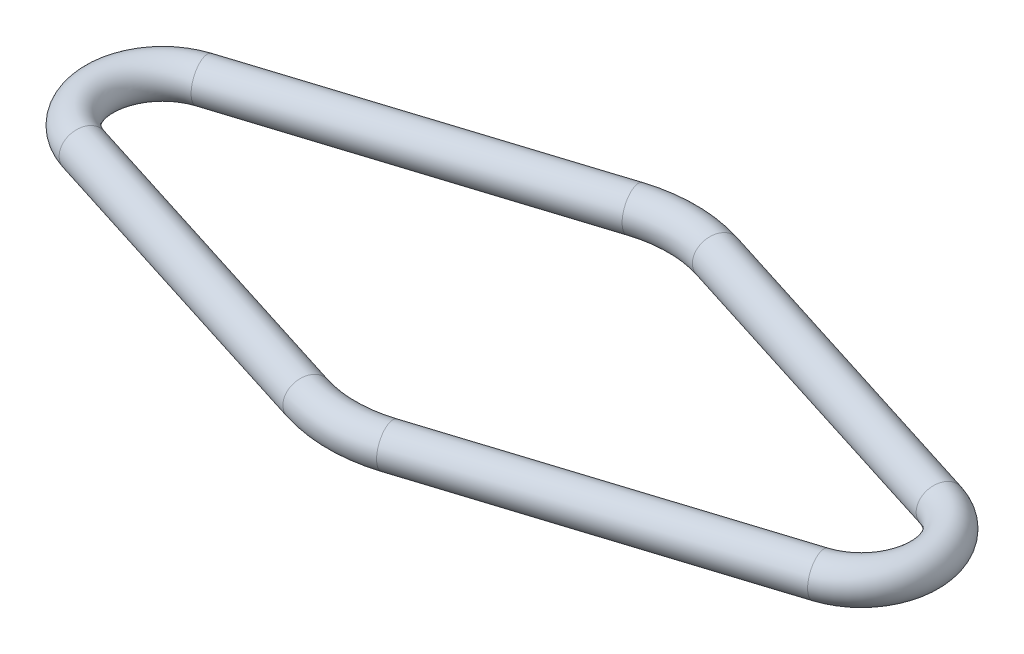
ISO-10303-21;
HEADER;
FILE_DESCRIPTION(('STEP AP214'),'2;1');
FILE_NAME('part.step','',(''),(''),'','','');
FILE_SCHEMA(('AUTOMOTIVE_DESIGN { 1 0 10303 214 1 1 1 1 }'));
ENDSEC;
DATA;
#1=APPLICATION_CONTEXT('core data for automotive mechanical design processes');
#2=APPLICATION_PROTOCOL_DEFINITION('international standard','automotive_design',2000,#1);
#3=PRODUCT_CONTEXT('',#1,'mechanical');
#4=PRODUCT('Part','Part','',(#3));
#5=PRODUCT_RELATED_PRODUCT_CATEGORY('part','',(#4));
#6=PRODUCT_DEFINITION_FORMATION('','',#4);
#7=PRODUCT_DEFINITION_CONTEXT('part definition',#1,'design');
#8=PRODUCT_DEFINITION('design','',#6,#7);
#9=PRODUCT_DEFINITION_SHAPE('','',#8);
#10=(LENGTH_UNIT() NAMED_UNIT(*) SI_UNIT(.MILLI.,.METRE.));
#11=(NAMED_UNIT(*) PLANE_ANGLE_UNIT() SI_UNIT($,.RADIAN.));
#12=(NAMED_UNIT(*) SI_UNIT($,.STERADIAN.) SOLID_ANGLE_UNIT());
#13=UNCERTAINTY_MEASURE_WITH_UNIT(LENGTH_MEASURE(1.E-05),#10,'distance_accuracy_value','');
#14=(GEOMETRIC_REPRESENTATION_CONTEXT(3) GLOBAL_UNCERTAINTY_ASSIGNED_CONTEXT((#13)) GLOBAL_UNIT_ASSIGNED_CONTEXT((#10,
#11,#12)) REPRESENTATION_CONTEXT('',''));
#15=CARTESIAN_POINT('',(0.,0.,0.));
#16=DIRECTION('',(0.,0.,1.));
#17=DIRECTION('',(1.,0.,0.));
#18=AXIS2_PLACEMENT_3D('',#15,#16,#17);
#19=CARTESIAN_POINT('',(-1.68984396552235,0.,6.75004542451107));
#20=DIRECTION('',(-0.953384602019686,0.,-0.301757850986124));
#21=DIRECTION('',(-0.301757850986124,0.,0.953384602019687));
#22=AXIS2_PLACEMENT_3D('',#19,#20,#21);
#23=CYLINDRICAL_SURFACE('',#22,0.8);
#24=CARTESIAN_POINT('',(-15.1845704125639,0.,2.47879996525119));
#25=DIRECTION('',(0.953384602019687,0.,0.301757850986124));
#26=DIRECTION('',(0.301757850986124,0.,-0.953384602019687));
#27=AXIS2_PLACEMENT_3D('',#24,#25,#26);
#28=CIRCLE('',#27,0.8);
#29=CARTESIAN_POINT('',(-15.4259766933528,0.,3.24150764686694));
#30=VERTEX_POINT('',#29);
#31=EDGE_CURVE('E56',#30,#30,#28,.T.);
#32=ORIENTED_EDGE('',*,*,#31,.T.);
#33=EDGE_LOOP('',(#32));
#34=FACE_BOUND('',#33,.T.);
#35=CARTESIAN_POINT('',(-1.68984396552235,0.,6.75004542451107));
#36=DIRECTION('',(0.953384602019687,0.,0.301757850986124));
#37=DIRECTION('',(0.301757850986124,0.,-0.953384602019687));
#38=AXIS2_PLACEMENT_3D('',#35,#36,#37);
#39=CIRCLE('',#38,0.8);
#40=CARTESIAN_POINT('',(-1.93125024631125,0.,7.51275310612682));
#41=VERTEX_POINT('',#40);
#42=EDGE_CURVE('E59',#41,#41,#39,.T.);
#43=ORIENTED_EDGE('',*,*,#42,.F.);
#44=EDGE_LOOP('',(#43));
#45=FACE_BOUND('',#44,.T.);
#46=ADVANCED_FACE('F30',(#34,#45),#23,.T.);
#47=CARTESIAN_POINT('',(-14.4,0.,0.));
#48=DIRECTION('',(0.,-1.,0.));
#49=DIRECTION('',(0.,0.,-1.));
#50=AXIS2_PLACEMENT_3D('',#47,#48,#49);
#51=TOROIDAL_SURFACE('',#50,2.6,0.8);
#52=CARTESIAN_POINT('',(-15.1845704125639,0.,-2.47879996525119));
#53=DIRECTION('',(-0.953384602019687,0.,0.301757850986124));
#54=DIRECTION('',(0.301757850986124,0.,0.953384602019687));
#55=AXIS2_PLACEMENT_3D('',#52,#53,#54);
#56=CIRCLE('',#55,0.8);
#57=CARTESIAN_POINT('',(-15.4259766933528,0.,-3.24150764686694));
#58=VERTEX_POINT('',#57);
#59=EDGE_CURVE('E53',#58,#58,#56,.T.);
#60=CARTESIAN_POINT('',(-14.4,0.,0.));
#61=DIRECTION('',(0.,-1.,0.));
#62=DIRECTION('',(0.,0.,-1.));
#63=AXIS2_PLACEMENT_3D('',#60,#61,#62);
#64=CIRCLE('',#63,3.4);
#65=EDGE_CURVE('',#30,#58,#64,.T.);
#66=ORIENTED_EDGE('',*,*,#31,.F.);
#67=ORIENTED_EDGE('',*,*,#59,.T.);
#68=ORIENTED_EDGE('',*,*,#65,.T.);
#69=ORIENTED_EDGE('',*,*,#65,.F.);
#70=EDGE_LOOP('',(#66,#68,#67,#69));
#71=FACE_BOUND('',#70,.T.);
#72=ADVANCED_FACE('F66',(#71),#51,.T.);
#73=CARTESIAN_POINT('',(-15.1845704125639,0.,-2.47879996525119));
#74=DIRECTION('',(0.953384602019686,0.,-0.301757850986124));
#75=DIRECTION('',(-0.301757850986124,0.,-0.953384602019687));
#76=AXIS2_PLACEMENT_3D('',#73,#74,#75);
#77=CYLINDRICAL_SURFACE('',#76,0.8);
#78=CARTESIAN_POINT('',(-1.68984396552235,0.,-6.75004542451107));
#79=DIRECTION('',(-0.953384602019687,0.,0.301757850986124));
#80=DIRECTION('',(0.301757850986124,0.,0.953384602019686));
#81=AXIS2_PLACEMENT_3D('',#78,#79,#80);
#82=CIRCLE('',#81,0.8);
#83=CARTESIAN_POINT('',(-1.93125024631125,0.,-7.51275310612682));
#84=VERTEX_POINT('',#83);
#85=EDGE_CURVE('E50',#84,#84,#82,.T.);
#86=CARTESIAN_POINT('',(-1.93125024631125,0.,-7.51275310612682));
#87=CARTESIAN_POINT('',(-2.07182031346793,0.,-7.4682609659262));
#88=CARTESIAN_POINT('',(-2.21239038062462,0.,-7.42376882572557));
#89=CARTESIAN_POINT('',(-2.49353051493798,0.,-7.33478454532433));
#90=CARTESIAN_POINT('',(-2.63410058209467,0.,-7.2902924051237));
#91=CARTESIAN_POINT('',(-2.91524071640803,0.,-7.20130812472245));
#92=CARTESIAN_POINT('',(-3.05581078356472,0.,-7.15681598452183));
#93=CARTESIAN_POINT('',(-3.33695091787808,0.,-7.06783170412058));
#94=CARTESIAN_POINT('',(-3.47752098503476,0.,-7.02333956391996));
#95=CARTESIAN_POINT('',(-3.75866111934813,0.,-6.93435528351871));
#96=CARTESIAN_POINT('',(-3.89923118650481,0.,-6.88986314331809));
#97=CARTESIAN_POINT('',(-4.18037132081818,0.,-6.80087886291684));
#98=CARTESIAN_POINT('',(-4.32094138797486,0.,-6.75638672271622));
#99=CARTESIAN_POINT('',(-4.60208152228823,0.,-6.66740244231497));
#100=CARTESIAN_POINT('',(-4.74265158944491,0.,-6.62291030211435));
#101=CARTESIAN_POINT('',(-5.02379172375828,0.,-6.5339260217131));
#102=CARTESIAN_POINT('',(-5.16436179091496,0.,-6.48943388151247));
#103=CARTESIAN_POINT('',(-5.44550192522833,0.,-6.40044960111123));
#104=CARTESIAN_POINT('',(-5.58607199238501,0.,-6.3559574609106));
#105=CARTESIAN_POINT('',(-5.86721212669838,0.,-6.26697318050935));
#106=CARTESIAN_POINT('',(-6.00778219385506,0.,-6.22248104030873));
#107=CARTESIAN_POINT('',(-6.28892232816843,0.,-6.13349675990748));
#108=CARTESIAN_POINT('',(-6.42949239532511,0.,-6.08900461970686));
#109=CARTESIAN_POINT('',(-6.71063252963848,0.,-6.00002033930561));
#110=CARTESIAN_POINT('',(-6.85120259679516,0.,-5.95552819910499));
#111=CARTESIAN_POINT('',(-7.13234273110853,0.,-5.86654391870374));
#112=CARTESIAN_POINT('',(-7.27291279826521,0.,-5.82205177850312));
#113=CARTESIAN_POINT('',(-7.55405293257857,0.,-5.73306749810187));
#114=CARTESIAN_POINT('',(-7.69462299973526,0.,-5.68857535790124));
#115=CARTESIAN_POINT('',(-7.97576313404862,0.,-5.5995910775));
#116=CARTESIAN_POINT('',(-8.1163332012053,0.,-5.55509893729937));
#117=CARTESIAN_POINT('',(-8.39747333551867,0.,-5.46611465689813));
#118=CARTESIAN_POINT('',(-8.53804340267535,0.,-5.4216225166975));
#119=CARTESIAN_POINT('',(-8.81918353698872,0.,-5.33263823629625));
#120=CARTESIAN_POINT('',(-8.9597536041454,0.,-5.28814609609563));
#121=CARTESIAN_POINT('',(-9.24089373845877,0.,-5.19916181569438));
#122=CARTESIAN_POINT('',(-9.38146380561545,0.,-5.15466967549376));
#123=CARTESIAN_POINT('',(-9.66260393992882,0.,-5.06568539509251));
#124=CARTESIAN_POINT('',(-9.8031740070855,0.,-5.02119325489189));
#125=CARTESIAN_POINT('',(-10.0843141413989,0.,-4.93220897449064));
#126=CARTESIAN_POINT('',(-10.2248842085556,0.,-4.88771683429002));
#127=CARTESIAN_POINT('',(-10.5060243428689,0.,-4.79873255388877));
#128=CARTESIAN_POINT('',(-10.6465944100256,0.,-4.75424041368814));
#129=CARTESIAN_POINT('',(-10.927734544339,0.,-4.6652561332869));
#130=CARTESIAN_POINT('',(-11.0683046114957,0.,-4.62076399308627));
#131=CARTESIAN_POINT('',(-11.349444745809,0.,-4.53177971268502));
#132=CARTESIAN_POINT('',(-11.4900148129657,0.,-4.4872875724844));
#133=CARTESIAN_POINT('',(-11.7711549472791,0.,-4.39830329208315));
#134=CARTESIAN_POINT('',(-11.9117250144357,0.,-4.35381115188253));
#135=CARTESIAN_POINT('',(-12.1928651487491,0.,-4.26482687148128));
#136=CARTESIAN_POINT('',(-12.3334352159058,0.,-4.22033473128066));
#137=CARTESIAN_POINT('',(-12.6145753502192,0.,-4.13135045087941));
#138=CARTESIAN_POINT('',(-12.7551454173758,0.,-4.08685831067879));
#139=CARTESIAN_POINT('',(-13.0362855516892,0.,-3.99787403027754));
#140=CARTESIAN_POINT('',(-13.1768556188459,0.,-3.95338189007692));
#141=CARTESIAN_POINT('',(-13.4579957531593,0.,-3.86439760967567));
#142=CARTESIAN_POINT('',(-13.5985658203159,0.,-3.81990546947504));
#143=CARTESIAN_POINT('',(-13.8797059546293,0.,-3.7309211890738));
#144=CARTESIAN_POINT('',(-14.020276021786,0.,-3.68642904887317));
#145=CARTESIAN_POINT('',(-14.3014161560994,0.,-3.59744476847193));
#146=CARTESIAN_POINT('',(-14.441986223256,0.,-3.5529526282713));
#147=CARTESIAN_POINT('',(-14.7231263575694,0.,-3.46396834787005));
#148=CARTESIAN_POINT('',(-14.8636964247261,0.,-3.41947620766943));
#149=CARTESIAN_POINT('',(-15.1448365590395,0.,-3.33049192726818));
#150=CARTESIAN_POINT('',(-15.2854066261961,0.,-3.28599978706756));
#151=CARTESIAN_POINT('',(-15.4259766933528,0.,-3.24150764686694));
#152=B_SPLINE_CURVE_WITH_KNOTS('',3,(#86,#87,#88,#89,#90,#91,#92,#93,#94,#95,#96,#97,#98,#99,
#100,#101,#102,#103,#104,#105,#106,#107,#108,#109,#110,#111,#112,#113,#114,#115,#116,#117,#118,
#119,#120,#121,#122,#123,#124,#125,#126,#127,#128,#129,#130,#131,#132,#133,#134,#135,#136,#137,
#138,#139,#140,#141,#142,#143,#144,#145,#146,#147,#148,#149,#150,#151),.UNSPECIFIED.,.F.,.F.,(4,
2,2,2,2,2,2,2,2,2,2,2,2,2,2,2,2,2,2,2,2,2,2,2,2,2,2,2,2,2,2,2,4),(0.,0.442329570434306,
0.884659140868611,1.32698871130292,1.76931828173722,2.21164785217153,2.65397742260583,
3.09630699304014,3.53863656347444,3.98096613390875,4.42329570434306,4.86562527477736,
5.30795484521167,5.75028441564597,6.19261398608027,6.63494355651458,7.07727312694889,
7.51960269738319,7.9619322678175,8.4042618382518,8.84659140868611,9.28892097912042,
9.73125054955472,10.173580119989,10.6159096904233,11.0582392608576,11.5005688312919,
11.9428984017262,12.3852279721606,12.8275575425949,13.2698871130292,13.7122166834635,
14.1545462538978),.UNSPECIFIED.);
#153=EDGE_CURVE('BSEAM72',#84,#58,#152,.T.);
#154=ORIENTED_EDGE('',*,*,#85,.T.);
#155=ORIENTED_EDGE('',*,*,#59,.F.);
#156=ORIENTED_EDGE('',*,*,#153,.T.);
#157=ORIENTED_EDGE('',*,*,#153,.F.);
#158=EDGE_LOOP('',(#154,#156,#155,#157));
#159=FACE_BOUND('',#158,.T.);
#160=ADVANCED_FACE('F72',(#159),#77,.T.);
#161=CARTESIAN_POINT('',(0.,0.,-1.41109165320067));
#162=DIRECTION('',(0.,-1.,0.));
#163=DIRECTION('',(0.,0.,-1.));
#164=AXIS2_PLACEMENT_3D('',#161,#162,#163);
#165=TOROIDAL_SURFACE('',#164,5.60000000000017,0.8);
#166=CARTESIAN_POINT('',(1.68984396552235,0.,-6.75004542451107));
#167=DIRECTION('',(-0.953384602019687,0.,-0.301757850986124));
#168=DIRECTION('',(-0.301757850986124,0.,0.953384602019686));
#169=AXIS2_PLACEMENT_3D('',#166,#167,#168);
#170=CIRCLE('',#169,0.8);
#171=CARTESIAN_POINT('',(1.93125024631125,0.,-7.51275310612682));
#172=VERTEX_POINT('',#171);
#173=EDGE_CURVE('E45',#172,#172,#170,.T.);
#174=CARTESIAN_POINT('',(0.,0.,-1.41109165320067));
#175=DIRECTION('',(0.,-1.,0.));
#176=DIRECTION('',(0.,0.,-1.));
#177=AXIS2_PLACEMENT_3D('',#174,#175,#176);
#178=CIRCLE('',#177,6.40000000000017);
#179=EDGE_CURVE('',#84,#172,#178,.T.);
#180=ORIENTED_EDGE('',*,*,#85,.F.);
#181=ORIENTED_EDGE('',*,*,#173,.T.);
#182=ORIENTED_EDGE('',*,*,#179,.T.);
#183=ORIENTED_EDGE('',*,*,#179,.F.);
#184=EDGE_LOOP('',(#180,#182,#181,#183));
#185=FACE_BOUND('',#184,.T.);
#186=ADVANCED_FACE('F78',(#185),#165,.T.);
#187=CARTESIAN_POINT('',(1.68984396552235,0.,-6.75004542451107));
#188=DIRECTION('',(0.953384602019686,0.,0.301757850986124));
#189=DIRECTION('',(0.301757850986124,0.,-0.953384602019687));
#190=AXIS2_PLACEMENT_3D('',#187,#188,#189);
#191=CYLINDRICAL_SURFACE('',#190,0.8);
#192=CARTESIAN_POINT('',(15.1845704125639,0.,-2.47879996525119));
#193=DIRECTION('',(-0.953384602019687,0.,-0.301757850986124));
#194=DIRECTION('',(-0.301757850986124,0.,0.953384602019687));
#195=AXIS2_PLACEMENT_3D('',#192,#193,#194);
#196=CIRCLE('',#195,0.8);
#197=CARTESIAN_POINT('',(15.4259766933528,0.,-3.24150764686694));
#198=VERTEX_POINT('',#197);
#199=EDGE_CURVE('E41',#198,#198,#196,.T.);
#200=ORIENTED_EDGE('',*,*,#199,.T.);
#201=EDGE_LOOP('',(#200));
#202=FACE_BOUND('',#201,.T.);
#203=ORIENTED_EDGE('',*,*,#173,.F.);
#204=EDGE_LOOP('',(#203));
#205=FACE_BOUND('',#204,.T.);
#206=ADVANCED_FACE('F82',(#202,#205),#191,.T.);
#207=CARTESIAN_POINT('',(14.4,0.,0.));
#208=DIRECTION('',(0.,-1.,0.));
#209=DIRECTION('',(0.,0.,-1.));
#210=AXIS2_PLACEMENT_3D('',#207,#208,#209);
#211=TOROIDAL_SURFACE('',#210,2.6,0.8);
#212=CARTESIAN_POINT('',(15.1845704125639,0.,2.47879996525119));
#213=DIRECTION('',(0.953384602019686,0.,-0.301757850986125));
#214=DIRECTION('',(-0.301757850986125,0.,-0.953384602019686));
#215=AXIS2_PLACEMENT_3D('',#212,#213,#214);
#216=CIRCLE('',#215,0.8);
#217=CARTESIAN_POINT('',(15.4259766933528,0.,3.24150764686694));
#218=VERTEX_POINT('',#217);
#219=EDGE_CURVE('E37',#218,#218,#216,.T.);
#220=CARTESIAN_POINT('',(14.4,0.,0.));
#221=DIRECTION('',(0.,-1.,0.));
#222=DIRECTION('',(0.,0.,-1.));
#223=AXIS2_PLACEMENT_3D('',#220,#221,#222);
#224=CIRCLE('',#223,3.4);
#225=EDGE_CURVE('',#198,#218,#224,.T.);
#226=ORIENTED_EDGE('',*,*,#199,.F.);
#227=ORIENTED_EDGE('',*,*,#219,.T.);
#228=ORIENTED_EDGE('',*,*,#225,.T.);
#229=ORIENTED_EDGE('',*,*,#225,.F.);
#230=EDGE_LOOP('',(#226,#228,#227,#229));
#231=FACE_BOUND('',#230,.T.);
#232=ADVANCED_FACE('F86',(#231),#211,.T.);
#233=CARTESIAN_POINT('',(15.1845704125639,0.,2.47879996525119));
#234=DIRECTION('',(-0.953384602019686,0.,0.301757850986124));
#235=DIRECTION('',(0.301757850986124,0.,0.953384602019687));
#236=AXIS2_PLACEMENT_3D('',#233,#234,#235);
#237=CYLINDRICAL_SURFACE('',#236,0.8);
#238=CARTESIAN_POINT('',(1.68984396552235,0.,6.75004542451107));
#239=DIRECTION('',(0.953384602019687,0.,-0.301757850986124));
#240=DIRECTION('',(-0.301757850986124,0.,-0.953384602019686));
#241=AXIS2_PLACEMENT_3D('',#238,#239,#240);
#242=CIRCLE('',#241,0.8);
#243=CARTESIAN_POINT('',(1.93125024631125,0.,7.51275310612682));
#244=VERTEX_POINT('',#243);
#245=EDGE_CURVE('E10',#244,#244,#242,.T.);
#246=CARTESIAN_POINT('',(1.93125024631125,0.,7.51275310612682));
#247=CARTESIAN_POINT('',(2.07182031346793,0.,7.4682609659262));
#248=CARTESIAN_POINT('',(2.21239038062462,0.,7.42376882572557));
#249=CARTESIAN_POINT('',(2.49353051493798,0.,7.33478454532433));
#250=CARTESIAN_POINT('',(2.63410058209467,0.,7.2902924051237));
#251=CARTESIAN_POINT('',(2.91524071640803,0.,7.20130812472245));
#252=CARTESIAN_POINT('',(3.05581078356472,0.,7.15681598452183));
#253=CARTESIAN_POINT('',(3.33695091787808,0.,7.06783170412058));
#254=CARTESIAN_POINT('',(3.47752098503476,0.,7.02333956391996));
#255=CARTESIAN_POINT('',(3.75866111934813,0.,6.93435528351871));
#256=CARTESIAN_POINT('',(3.89923118650481,0.,6.88986314331809));
#257=CARTESIAN_POINT('',(4.18037132081818,0.,6.80087886291684));
#258=CARTESIAN_POINT('',(4.32094138797486,0.,6.75638672271622));
#259=CARTESIAN_POINT('',(4.60208152228823,0.,6.66740244231497));
#260=CARTESIAN_POINT('',(4.74265158944491,0.,6.62291030211435));
#261=CARTESIAN_POINT('',(5.02379172375828,0.,6.5339260217131));
#262=CARTESIAN_POINT('',(5.16436179091496,0.,6.48943388151247));
#263=CARTESIAN_POINT('',(5.44550192522833,0.,6.40044960111123));
#264=CARTESIAN_POINT('',(5.58607199238501,0.,6.3559574609106));
#265=CARTESIAN_POINT('',(5.86721212669838,0.,6.26697318050935));
#266=CARTESIAN_POINT('',(6.00778219385506,0.,6.22248104030873));
#267=CARTESIAN_POINT('',(6.28892232816843,0.,6.13349675990748));
#268=CARTESIAN_POINT('',(6.42949239532511,0.,6.08900461970686));
#269=CARTESIAN_POINT('',(6.71063252963848,0.,6.00002033930561));
#270=CARTESIAN_POINT('',(6.85120259679516,0.,5.95552819910499));
#271=CARTESIAN_POINT('',(7.13234273110853,0.,5.86654391870374));
#272=CARTESIAN_POINT('',(7.27291279826521,0.,5.82205177850312));
#273=CARTESIAN_POINT('',(7.55405293257857,0.,5.73306749810187));
#274=CARTESIAN_POINT('',(7.69462299973526,0.,5.68857535790124));
#275=CARTESIAN_POINT('',(7.97576313404862,0.,5.5995910775));
#276=CARTESIAN_POINT('',(8.1163332012053,0.,5.55509893729937));
#277=CARTESIAN_POINT('',(8.39747333551867,0.,5.46611465689813));
#278=CARTESIAN_POINT('',(8.53804340267535,0.,5.4216225166975));
#279=CARTESIAN_POINT('',(8.81918353698872,0.,5.33263823629625));
#280=CARTESIAN_POINT('',(8.9597536041454,0.,5.28814609609563));
#281=CARTESIAN_POINT('',(9.24089373845877,0.,5.19916181569438));
#282=CARTESIAN_POINT('',(9.38146380561545,0.,5.15466967549376));
#283=CARTESIAN_POINT('',(9.66260393992882,0.,5.06568539509251));
#284=CARTESIAN_POINT('',(9.8031740070855,0.,5.02119325489189));
#285=CARTESIAN_POINT('',(10.0843141413989,0.,4.93220897449064));
#286=CARTESIAN_POINT('',(10.2248842085556,0.,4.88771683429002));
#287=CARTESIAN_POINT('',(10.5060243428689,0.,4.79873255388877));
#288=CARTESIAN_POINT('',(10.6465944100256,0.,4.75424041368814));
#289=CARTESIAN_POINT('',(10.927734544339,0.,4.6652561332869));
#290=CARTESIAN_POINT('',(11.0683046114957,0.,4.62076399308627));
#291=CARTESIAN_POINT('',(11.349444745809,0.,4.53177971268502));
#292=CARTESIAN_POINT('',(11.4900148129657,0.,4.4872875724844));
#293=CARTESIAN_POINT('',(11.7711549472791,0.,4.39830329208315));
#294=CARTESIAN_POINT('',(11.9117250144357,0.,4.35381115188253));
#295=CARTESIAN_POINT('',(12.1928651487491,0.,4.26482687148128));
#296=CARTESIAN_POINT('',(12.3334352159058,0.,4.22033473128066));
#297=CARTESIAN_POINT('',(12.6145753502192,0.,4.13135045087941));
#298=CARTESIAN_POINT('',(12.7551454173758,0.,4.08685831067879));
#299=CARTESIAN_POINT('',(13.0362855516892,0.,3.99787403027754));
#300=CARTESIAN_POINT('',(13.1768556188459,0.,3.95338189007692));
#301=CARTESIAN_POINT('',(13.4579957531593,0.,3.86439760967567));
#302=CARTESIAN_POINT('',(13.5985658203159,0.,3.81990546947504));
#303=CARTESIAN_POINT('',(13.8797059546293,0.,3.7309211890738));
#304=CARTESIAN_POINT('',(14.020276021786,0.,3.68642904887317));
#305=CARTESIAN_POINT('',(14.3014161560994,0.,3.59744476847193));
#306=CARTESIAN_POINT('',(14.441986223256,0.,3.5529526282713));
#307=CARTESIAN_POINT('',(14.7231263575694,0.,3.46396834787005));
#308=CARTESIAN_POINT('',(14.8636964247261,0.,3.41947620766943));
#309=CARTESIAN_POINT('',(15.1448365590395,0.,3.33049192726818));
#310=CARTESIAN_POINT('',(15.2854066261961,0.,3.28599978706756));
#311=CARTESIAN_POINT('',(15.4259766933528,0.,3.24150764686694));
#312=B_SPLINE_CURVE_WITH_KNOTS('',3,(#246,#247,#248,#249,#250,#251,#252,#253,#254,#255,#256,
#257,#258,#259,#260,#261,#262,#263,#264,#265,#266,#267,#268,#269,#270,#271,#272,#273,#274,#275,
#276,#277,#278,#279,#280,#281,#282,#283,#284,#285,#286,#287,#288,#289,#290,#291,#292,#293,#294,
#295,#296,#297,#298,#299,#300,#301,#302,#303,#304,#305,#306,#307,#308,#309,#310,#311),
.UNSPECIFIED.,.F.,.F.,(4,2,2,2,2,2,2,2,2,2,2,2,2,2,2,2,2,2,2,2,2,2,2,2,2,2,2,2,2,2,2,2,4),(0.,
0.442329570434306,0.884659140868611,1.32698871130292,1.76931828173722,2.21164785217153,
2.65397742260583,3.09630699304014,3.53863656347444,3.98096613390875,4.42329570434306,
4.86562527477736,5.30795484521167,5.75028441564597,6.19261398608027,6.63494355651458,
7.07727312694889,7.51960269738319,7.9619322678175,8.4042618382518,8.84659140868611,
9.28892097912042,9.73125054955472,10.173580119989,10.6159096904233,11.0582392608576,
11.5005688312919,11.9428984017262,12.3852279721606,12.8275575425949,13.2698871130292,
13.7122166834635,14.1545462538978),.UNSPECIFIED.);
#313=EDGE_CURVE('BSEAM89',#244,#218,#312,.T.);
#314=ORIENTED_EDGE('',*,*,#245,.T.);
#315=ORIENTED_EDGE('',*,*,#219,.F.);
#316=ORIENTED_EDGE('',*,*,#313,.T.);
#317=ORIENTED_EDGE('',*,*,#313,.F.);
#318=EDGE_LOOP('',(#314,#316,#315,#317));
#319=FACE_BOUND('',#318,.T.);
#320=ADVANCED_FACE('F89',(#319),#237,.T.);
#321=CARTESIAN_POINT('',(0.,0.,1.41109165320066));
#322=DIRECTION('',(0.,-1.,0.));
#323=DIRECTION('',(0.,0.,-1.));
#324=AXIS2_PLACEMENT_3D('',#321,#322,#323);
#325=TOROIDAL_SURFACE('',#324,5.60000000000017,0.8);
#326=CARTESIAN_POINT('',(0.,0.,1.41109165320066));
#327=DIRECTION('',(0.,-1.,0.));
#328=DIRECTION('',(0.,0.,-1.));
#329=AXIS2_PLACEMENT_3D('',#326,#327,#328);
#330=CIRCLE('',#329,6.40000000000017);
#331=EDGE_CURVE('',#244,#41,#330,.T.);
#332=ORIENTED_EDGE('',*,*,#245,.F.);
#333=ORIENTED_EDGE('',*,*,#42,.T.);
#334=ORIENTED_EDGE('',*,*,#331,.T.);
#335=ORIENTED_EDGE('',*,*,#331,.F.);
#336=EDGE_LOOP('',(#332,#334,#333,#335));
#337=FACE_BOUND('',#336,.T.);
#338=ADVANCED_FACE('F32',(#337),#325,.T.);
#339=CLOSED_SHELL('',(#46,#72,#160,#186,#206,#232,#320,#338));
#340=MANIFOLD_SOLID_BREP('B2',#339);
#341=ADVANCED_BREP_SHAPE_REPRESENTATION('',(#18,#340),#14);
#342=SHAPE_DEFINITION_REPRESENTATION(#9,#341);
ENDSEC;
END-ISO-10303-21;
